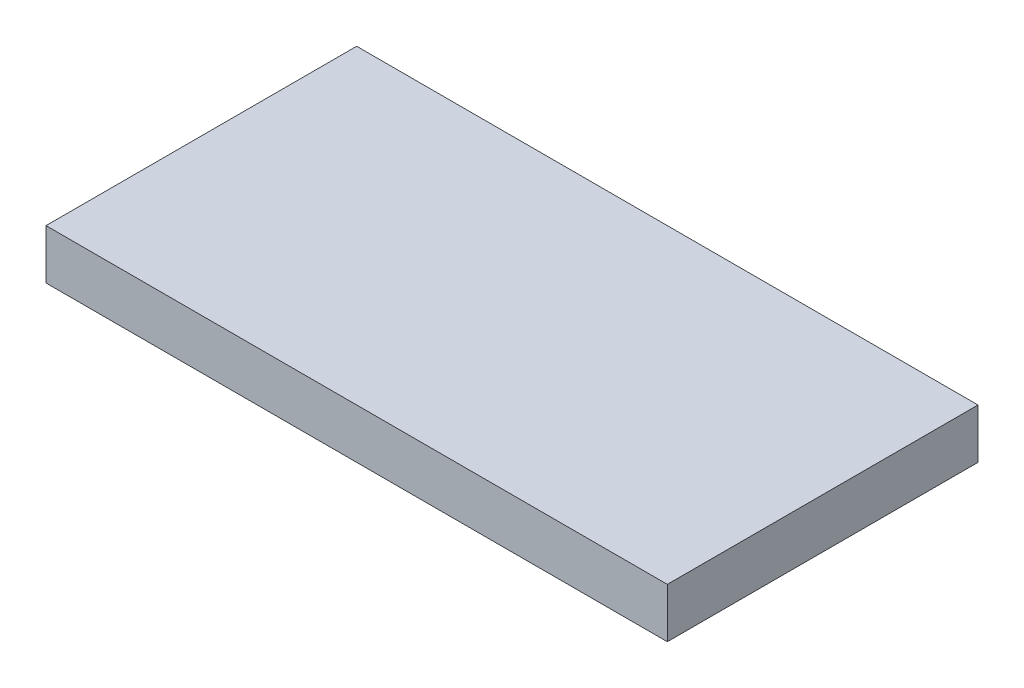
ISO-10303-21;
HEADER;
FILE_DESCRIPTION(('STEP AP214'),'2;1');
FILE_NAME('part.step','',(''),(''),'','','');
FILE_SCHEMA(('AUTOMOTIVE_DESIGN { 1 0 10303 214 1 1 1 1 }'));
ENDSEC;
DATA;
#1=APPLICATION_CONTEXT('core data for automotive mechanical design processes');
#2=APPLICATION_PROTOCOL_DEFINITION('international standard','automotive_design',2000,#1);
#3=PRODUCT_CONTEXT('',#1,'mechanical');
#4=PRODUCT('Part','Part','',(#3));
#5=PRODUCT_RELATED_PRODUCT_CATEGORY('part','',(#4));
#6=PRODUCT_DEFINITION_FORMATION('','',#4);
#7=PRODUCT_DEFINITION_CONTEXT('part definition',#1,'design');
#8=PRODUCT_DEFINITION('design','',#6,#7);
#9=PRODUCT_DEFINITION_SHAPE('','',#8);
#10=(LENGTH_UNIT() NAMED_UNIT(*) SI_UNIT(.MILLI.,.METRE.));
#11=(NAMED_UNIT(*) PLANE_ANGLE_UNIT() SI_UNIT($,.RADIAN.));
#12=(NAMED_UNIT(*) SI_UNIT($,.STERADIAN.) SOLID_ANGLE_UNIT());
#13=UNCERTAINTY_MEASURE_WITH_UNIT(LENGTH_MEASURE(1.E-05),#10,'distance_accuracy_value','');
#14=(GEOMETRIC_REPRESENTATION_CONTEXT(3) GLOBAL_UNCERTAINTY_ASSIGNED_CONTEXT((#13)) GLOBAL_UNIT_ASSIGNED_CONTEXT((#10,
#11,#12)) REPRESENTATION_CONTEXT('',''));
#15=CARTESIAN_POINT('',(0.,0.,0.));
#16=DIRECTION('',(0.,0.,1.));
#17=DIRECTION('',(1.,0.,0.));
#18=AXIS2_PLACEMENT_3D('',#15,#16,#17);
#19=CARTESIAN_POINT('',(0.,1.6,0.));
#20=DIRECTION('',(-1.,0.,0.));
#21=DIRECTION('',(0.,0.,1.));
#22=AXIS2_PLACEMENT_3D('',#19,#20,#21);
#23=PLANE('',#22);
#24=DIRECTION('',(0.,0.,-1.));
#25=VECTOR('',#24,1.);
#26=CARTESIAN_POINT('',(0.,0.,0.));
#27=LINE('',#26,#25);
#28=CARTESIAN_POINT('',(0.,0.,0.));
#29=VERTEX_POINT('',#28);
#30=CARTESIAN_POINT('',(0.,0.,-10.));
#31=VERTEX_POINT('',#30);
#32=EDGE_CURVE('E98',#29,#31,#27,.T.);
#33=ORIENTED_EDGE('',*,*,#32,.F.);
#34=DIRECTION('',(0.,-1.,0.));
#35=VECTOR('',#34,1.);
#36=CARTESIAN_POINT('',(0.,1.6,0.));
#37=LINE('',#36,#35);
#38=CARTESIAN_POINT('',(0.,1.6,0.));
#39=VERTEX_POINT('',#38);
#40=EDGE_CURVE('E11',#39,#29,#37,.T.);
#41=ORIENTED_EDGE('',*,*,#40,.F.);
#42=DIRECTION('',(0.,0.,-1.));
#43=VECTOR('',#42,1.);
#44=CARTESIAN_POINT('',(0.,1.6,0.));
#45=LINE('',#44,#43);
#46=CARTESIAN_POINT('',(0.,1.6,-10.));
#47=VERTEX_POINT('',#46);
#48=EDGE_CURVE('E93',#39,#47,#45,.T.);
#49=ORIENTED_EDGE('',*,*,#48,.T.);
#50=DIRECTION('',(0.,-1.,0.));
#51=VECTOR('',#50,1.);
#52=CARTESIAN_POINT('',(0.,1.6,-10.));
#53=LINE('',#52,#51);
#54=EDGE_CURVE('E36',#47,#31,#53,.T.);
#55=ORIENTED_EDGE('',*,*,#54,.T.);
#56=EDGE_LOOP('',(#33,#41,#49,#55));
#57=FACE_BOUND('',#56,.T.);
#58=ADVANCED_FACE('F33',(#57),#23,.T.);
#59=CARTESIAN_POINT('',(0.,1.6,0.));
#60=DIRECTION('',(0.,0.,-1.));
#61=DIRECTION('',(-1.,0.,0.));
#62=AXIS2_PLACEMENT_3D('',#59,#60,#61);
#63=PLANE('',#62);
#64=DIRECTION('',(1.,0.,0.));
#65=VECTOR('',#64,1.);
#66=CARTESIAN_POINT('',(0.,0.,0.));
#67=LINE('',#66,#65);
#68=CARTESIAN_POINT('',(20.,0.,0.));
#69=VERTEX_POINT('',#68);
#70=EDGE_CURVE('E66',#29,#69,#67,.T.);
#71=ORIENTED_EDGE('',*,*,#70,.T.);
#72=DIRECTION('',(0.,-1.,0.));
#73=VECTOR('',#72,1.);
#74=CARTESIAN_POINT('',(20.,1.6,0.));
#75=LINE('',#74,#73);
#76=CARTESIAN_POINT('',(20.,1.6,0.));
#77=VERTEX_POINT('',#76);
#78=EDGE_CURVE('E42',#77,#69,#75,.T.);
#79=ORIENTED_EDGE('',*,*,#78,.F.);
#80=DIRECTION('',(1.,0.,0.));
#81=VECTOR('',#80,1.);
#82=CARTESIAN_POINT('',(0.,1.6,0.));
#83=LINE('',#82,#81);
#84=EDGE_CURVE('E83',#39,#77,#83,.T.);
#85=ORIENTED_EDGE('',*,*,#84,.F.);
#86=ORIENTED_EDGE('',*,*,#40,.T.);
#87=EDGE_LOOP('',(#71,#79,#85,#86));
#88=FACE_BOUND('',#87,.T.);
#89=ADVANCED_FACE('F108',(#88),#63,.F.);
#90=CARTESIAN_POINT('',(20.,1.6,0.));
#91=DIRECTION('',(-1.,0.,0.));
#92=DIRECTION('',(0.,0.,1.));
#93=AXIS2_PLACEMENT_3D('',#90,#91,#92);
#94=PLANE('',#93);
#95=DIRECTION('',(0.,0.,-1.));
#96=VECTOR('',#95,1.);
#97=CARTESIAN_POINT('',(20.,0.,0.));
#98=LINE('',#97,#96);
#99=CARTESIAN_POINT('',(20.,0.,-10.));
#100=VERTEX_POINT('',#99);
#101=EDGE_CURVE('E90',#69,#100,#98,.T.);
#102=ORIENTED_EDGE('',*,*,#101,.T.);
#103=DIRECTION('',(0.,-1.,0.));
#104=VECTOR('',#103,1.);
#105=CARTESIAN_POINT('',(20.,1.6,-10.));
#106=LINE('',#105,#104);
#107=CARTESIAN_POINT('',(20.,1.6,-10.));
#108=VERTEX_POINT('',#107);
#109=EDGE_CURVE('E87',#108,#100,#106,.T.);
#110=ORIENTED_EDGE('',*,*,#109,.F.);
#111=DIRECTION('',(0.,0.,-1.));
#112=VECTOR('',#111,1.);
#113=CARTESIAN_POINT('',(20.,1.6,0.));
#114=LINE('',#113,#112);
#115=EDGE_CURVE('E78',#77,#108,#114,.T.);
#116=ORIENTED_EDGE('',*,*,#115,.F.);
#117=ORIENTED_EDGE('',*,*,#78,.T.);
#118=EDGE_LOOP('',(#102,#110,#116,#117));
#119=FACE_BOUND('',#118,.T.);
#120=ADVANCED_FACE('F88',(#119),#94,.F.);
#121=CARTESIAN_POINT('',(0.,1.6,-10.));
#122=DIRECTION('',(0.,0.,-1.));
#123=DIRECTION('',(-1.,0.,0.));
#124=AXIS2_PLACEMENT_3D('',#121,#122,#123);
#125=PLANE('',#124);
#126=DIRECTION('',(1.,0.,0.));
#127=VECTOR('',#126,1.);
#128=CARTESIAN_POINT('',(0.,0.,-10.));
#129=LINE('',#128,#127);
#130=EDGE_CURVE('E101',#31,#100,#129,.T.);
#131=ORIENTED_EDGE('',*,*,#130,.F.);
#132=ORIENTED_EDGE('',*,*,#54,.F.);
#133=DIRECTION('',(1.,0.,0.));
#134=VECTOR('',#133,1.);
#135=CARTESIAN_POINT('',(0.,1.6,-10.));
#136=LINE('',#135,#134);
#137=EDGE_CURVE('E82',#47,#108,#136,.T.);
#138=ORIENTED_EDGE('',*,*,#137,.T.);
#139=ORIENTED_EDGE('',*,*,#109,.T.);
#140=EDGE_LOOP('',(#131,#132,#138,#139));
#141=FACE_BOUND('',#140,.T.);
#142=ADVANCED_FACE('F92',(#141),#125,.T.);
#143=CARTESIAN_POINT('',(0.,1.6,0.));
#144=DIRECTION('',(0.,-1.,0.));
#145=DIRECTION('',(0.,0.,-1.));
#146=AXIS2_PLACEMENT_3D('',#143,#144,#145);
#147=PLANE('',#146);
#148=ORIENTED_EDGE('',*,*,#48,.F.);
#149=ORIENTED_EDGE('',*,*,#84,.T.);
#150=ORIENTED_EDGE('',*,*,#115,.T.);
#151=ORIENTED_EDGE('',*,*,#137,.F.);
#152=EDGE_LOOP('',(#148,#149,#150,#151));
#153=FACE_BOUND('',#152,.T.);
#154=ADVANCED_FACE('F81',(#153),#147,.F.);
#155=CARTESIAN_POINT('',(0.,0.,0.));
#156=DIRECTION('',(0.,-1.,0.));
#157=DIRECTION('',(0.,0.,-1.));
#158=AXIS2_PLACEMENT_3D('',#155,#156,#157);
#159=PLANE('',#158);
#160=ORIENTED_EDGE('',*,*,#32,.T.);
#161=ORIENTED_EDGE('',*,*,#130,.T.);
#162=ORIENTED_EDGE('',*,*,#101,.F.);
#163=ORIENTED_EDGE('',*,*,#70,.F.);
#164=EDGE_LOOP('',(#160,#161,#162,#163));
#165=FACE_BOUND('',#164,.T.);
#166=ADVANCED_FACE('F106',(#165),#159,.T.);
#167=CLOSED_SHELL('',(#58,#89,#120,#142,#154,#166));
#168=MANIFOLD_SOLID_BREP('B2',#167);
#169=ADVANCED_BREP_SHAPE_REPRESENTATION('',(#18,#168),#14);
#170=SHAPE_DEFINITION_REPRESENTATION(#9,#169);
ENDSEC;
END-ISO-10303-21;
